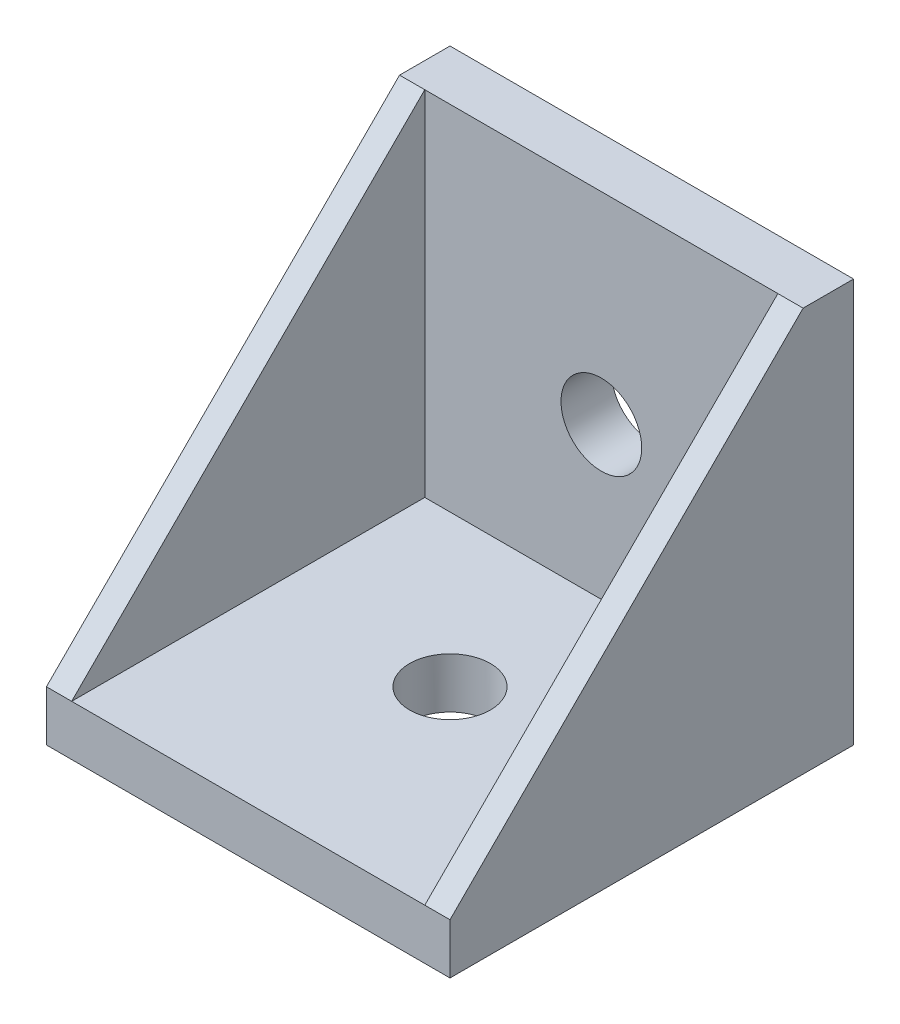
ISO-10303-21;
HEADER;
FILE_DESCRIPTION(('STEP AP214'),'2;1');
FILE_NAME('part.step','',(''),(''),'','','');
FILE_SCHEMA(('AUTOMOTIVE_DESIGN { 1 0 10303 214 1 1 1 1 }'));
ENDSEC;
DATA;
#1=APPLICATION_CONTEXT('core data for automotive mechanical design processes');
#2=APPLICATION_PROTOCOL_DEFINITION('international standard','automotive_design',2000,#1);
#3=PRODUCT_CONTEXT('',#1,'mechanical');
#4=PRODUCT('Part','Part','',(#3));
#5=PRODUCT_RELATED_PRODUCT_CATEGORY('part','',(#4));
#6=PRODUCT_DEFINITION_FORMATION('','',#4);
#7=PRODUCT_DEFINITION_CONTEXT('part definition',#1,'design');
#8=PRODUCT_DEFINITION('design','',#6,#7);
#9=PRODUCT_DEFINITION_SHAPE('','',#8);
#10=(LENGTH_UNIT() NAMED_UNIT(*) SI_UNIT(.MILLI.,.METRE.));
#11=(NAMED_UNIT(*) PLANE_ANGLE_UNIT() SI_UNIT($,.RADIAN.));
#12=(NAMED_UNIT(*) SI_UNIT($,.STERADIAN.) SOLID_ANGLE_UNIT());
#13=UNCERTAINTY_MEASURE_WITH_UNIT(LENGTH_MEASURE(1.E-05),#10,'distance_accuracy_value','');
#14=(GEOMETRIC_REPRESENTATION_CONTEXT(3) GLOBAL_UNCERTAINTY_ASSIGNED_CONTEXT((#13)) GLOBAL_UNIT_ASSIGNED_CONTEXT((#10,
#11,#12)) REPRESENTATION_CONTEXT('',''));
#15=CARTESIAN_POINT('',(0.,0.,0.));
#16=DIRECTION('',(0.,0.,1.));
#17=DIRECTION('',(1.,0.,0.));
#18=AXIS2_PLACEMENT_3D('',#15,#16,#17);
#19=CARTESIAN_POINT('',(-20.,40.,-15.));
#20=DIRECTION('',(0.,-0.707106781186548,-0.707106781186548));
#21=DIRECTION('',(0.,0.707106781186548,-0.707106781186548));
#22=AXIS2_PLACEMENT_3D('',#19,#20,#21);
#23=PLANE('',#22);
#24=DIRECTION('',(1.,0.,0.));
#25=VECTOR('',#24,1.);
#26=CARTESIAN_POINT('',(-20.,5.,20.));
#27=LINE('',#26,#25);
#28=CARTESIAN_POINT('',(-20.,5.,20.));
#29=VERTEX_POINT('',#28);
#30=CARTESIAN_POINT('',(-17.5,5.,20.));
#31=VERTEX_POINT('',#30);
#32=EDGE_CURVE('E152',#29,#31,#27,.T.);
#33=ORIENTED_EDGE('',*,*,#32,.T.);
#34=DIRECTION('',(0.,0.707106781186548,-0.707106781186548));
#35=VECTOR('',#34,1.);
#36=CARTESIAN_POINT('',(-17.5,40.,-15.));
#37=LINE('',#36,#35);
#38=CARTESIAN_POINT('',(-17.5,40.,-15.));
#39=VERTEX_POINT('',#38);
#40=EDGE_CURVE('E12',#31,#39,#37,.T.);
#41=ORIENTED_EDGE('',*,*,#40,.T.);
#42=DIRECTION('',(1.,0.,0.));
#43=VECTOR('',#42,1.);
#44=CARTESIAN_POINT('',(-20.,40.,-15.));
#45=LINE('',#44,#43);
#46=CARTESIAN_POINT('',(-20.,40.,-15.));
#47=VERTEX_POINT('',#46);
#48=EDGE_CURVE('E147',#47,#39,#45,.T.);
#49=ORIENTED_EDGE('',*,*,#48,.F.);
#50=DIRECTION('',(0.,0.707106781186548,-0.707106781186548));
#51=VECTOR('',#50,1.);
#52=CARTESIAN_POINT('',(-20.,40.,-15.));
#53=LINE('',#52,#51);
#54=EDGE_CURVE('E137',#29,#47,#53,.T.);
#55=ORIENTED_EDGE('',*,*,#54,.F.);
#56=EDGE_LOOP('',(#33,#41,#49,#55));
#57=FACE_BOUND('',#56,.T.);
#58=ADVANCED_FACE('F47',(#57),#23,.F.);
#59=CARTESIAN_POINT('',(20.,40.,-20.));
#60=DIRECTION('',(-1.,0.,0.));
#61=DIRECTION('',(0.,0.,1.));
#62=AXIS2_PLACEMENT_3D('',#59,#60,#61);
#63=PLANE('',#62);
#64=DIRECTION('',(0.,0.,-1.));
#65=VECTOR('',#64,1.);
#66=CARTESIAN_POINT('',(20.,40.,-20.));
#67=LINE('',#66,#65);
#68=CARTESIAN_POINT('',(20.,40.,-15.));
#69=VERTEX_POINT('',#68);
#70=CARTESIAN_POINT('',(20.,40.,-20.));
#71=VERTEX_POINT('',#70);
#72=EDGE_CURVE('E160',#69,#71,#67,.T.);
#73=ORIENTED_EDGE('',*,*,#72,.F.);
#74=DIRECTION('',(0.,-0.707106781186548,0.707106781186548));
#75=VECTOR('',#74,1.);
#76=CARTESIAN_POINT('',(20.,42.5,-17.5));
#77=LINE('',#76,#75);
#78=CARTESIAN_POINT('',(20.,5.,20.));
#79=VERTEX_POINT('',#78);
#80=EDGE_CURVE('E151',#69,#79,#77,.T.);
#81=ORIENTED_EDGE('',*,*,#80,.T.);
#82=DIRECTION('',(0.,-1.,0.));
#83=VECTOR('',#82,1.);
#84=CARTESIAN_POINT('',(20.,40.,20.));
#85=LINE('',#84,#83);
#86=CARTESIAN_POINT('',(20.,0.,20.));
#87=VERTEX_POINT('',#86);
#88=EDGE_CURVE('E171',#79,#87,#85,.T.);
#89=ORIENTED_EDGE('',*,*,#88,.T.);
#90=DIRECTION('',(0.,0.,-1.));
#91=VECTOR('',#90,1.);
#92=CARTESIAN_POINT('',(20.,0.,-20.));
#93=LINE('',#92,#91);
#94=CARTESIAN_POINT('',(20.,0.,-20.));
#95=VERTEX_POINT('',#94);
#96=EDGE_CURVE('E159',#87,#95,#93,.T.);
#97=ORIENTED_EDGE('',*,*,#96,.T.);
#98=DIRECTION('',(0.,-1.,0.));
#99=VECTOR('',#98,1.);
#100=CARTESIAN_POINT('',(20.,40.,-20.));
#101=LINE('',#100,#99);
#102=EDGE_CURVE('E194',#71,#95,#101,.T.);
#103=ORIENTED_EDGE('',*,*,#102,.F.);
#104=EDGE_LOOP('',(#73,#81,#89,#97,#103));
#105=FACE_BOUND('',#104,.T.);
#106=ADVANCED_FACE('F49',(#105),#63,.F.);
#107=CARTESIAN_POINT('',(-20.,40.,-20.));
#108=DIRECTION('',(0.,0.,1.));
#109=DIRECTION('',(1.,0.,0.));
#110=AXIS2_PLACEMENT_3D('',#107,#108,#109);
#111=PLANE('',#110);
#112=CARTESIAN_POINT('',(0.,20.,-20.));
#113=DIRECTION('',(0.,0.,1.));
#114=DIRECTION('',(1.,0.,0.));
#115=AXIS2_PLACEMENT_3D('',#112,#113,#114);
#116=CIRCLE('',#115,4.);
#117=CARTESIAN_POINT('',(4.,20.,-20.));
#118=VERTEX_POINT('',#117);
#119=EDGE_CURVE('E202',#118,#118,#116,.T.);
#120=ORIENTED_EDGE('',*,*,#119,.T.);
#121=EDGE_LOOP('',(#120));
#122=FACE_BOUND('',#121,.T.);
#123=DIRECTION('',(-1.,0.,0.));
#124=VECTOR('',#123,1.);
#125=CARTESIAN_POINT('',(-20.,0.,-20.));
#126=LINE('',#125,#124);
#127=CARTESIAN_POINT('',(-20.,0.,-20.));
#128=VERTEX_POINT('',#127);
#129=EDGE_CURVE('E175',#95,#128,#126,.T.);
#130=ORIENTED_EDGE('',*,*,#129,.T.);
#131=DIRECTION('',(0.,-1.,0.));
#132=VECTOR('',#131,1.);
#133=CARTESIAN_POINT('',(-20.,40.,-20.));
#134=LINE('',#133,#132);
#135=CARTESIAN_POINT('',(-20.,40.,-20.));
#136=VERTEX_POINT('',#135);
#137=EDGE_CURVE('E190',#136,#128,#134,.T.);
#138=ORIENTED_EDGE('',*,*,#137,.F.);
#139=DIRECTION('',(-1.,0.,0.));
#140=VECTOR('',#139,1.);
#141=CARTESIAN_POINT('',(-20.,40.,-20.));
#142=LINE('',#141,#140);
#143=EDGE_CURVE('E163',#71,#136,#142,.T.);
#144=ORIENTED_EDGE('',*,*,#143,.F.);
#145=ORIENTED_EDGE('',*,*,#102,.T.);
#146=EDGE_LOOP('',(#130,#138,#144,#145));
#147=FACE_BOUND('',#146,.T.);
#148=ADVANCED_FACE('F241',(#122,#147),#111,.F.);
#149=CARTESIAN_POINT('',(-20.,40.,-20.));
#150=DIRECTION('',(1.,0.,0.));
#151=DIRECTION('',(0.,0.,-1.));
#152=AXIS2_PLACEMENT_3D('',#149,#150,#151);
#153=PLANE('',#152);
#154=DIRECTION('',(0.,-1.,0.));
#155=VECTOR('',#154,1.);
#156=CARTESIAN_POINT('',(-20.,40.,20.));
#157=LINE('',#156,#155);
#158=CARTESIAN_POINT('',(-20.,0.,20.));
#159=VERTEX_POINT('',#158);
#160=EDGE_CURVE('E187',#29,#159,#157,.T.);
#161=ORIENTED_EDGE('',*,*,#160,.F.);
#162=ORIENTED_EDGE('',*,*,#54,.T.);
#163=DIRECTION('',(0.,0.,1.));
#164=VECTOR('',#163,1.);
#165=CARTESIAN_POINT('',(-20.,40.,-20.));
#166=LINE('',#165,#164);
#167=EDGE_CURVE('E167',#136,#47,#166,.T.);
#168=ORIENTED_EDGE('',*,*,#167,.F.);
#169=ORIENTED_EDGE('',*,*,#137,.T.);
#170=DIRECTION('',(0.,0.,1.));
#171=VECTOR('',#170,1.);
#172=CARTESIAN_POINT('',(-20.,0.,-20.));
#173=LINE('',#172,#171);
#174=EDGE_CURVE('E178',#128,#159,#173,.T.);
#175=ORIENTED_EDGE('',*,*,#174,.T.);
#176=EDGE_LOOP('',(#161,#162,#168,#169,#175));
#177=FACE_BOUND('',#176,.T.);
#178=ADVANCED_FACE('F245',(#177),#153,.F.);
#179=CARTESIAN_POINT('',(-20.,40.,20.));
#180=DIRECTION('',(0.,0.,-1.));
#181=DIRECTION('',(-1.,0.,0.));
#182=AXIS2_PLACEMENT_3D('',#179,#180,#181);
#183=PLANE('',#182);
#184=ORIENTED_EDGE('',*,*,#88,.F.);
#185=CARTESIAN_POINT('',(17.5,5.,20.));
#186=VERTEX_POINT('',#185);
#187=EDGE_CURVE('E142',#186,#79,#27,.T.);
#188=ORIENTED_EDGE('',*,*,#187,.F.);
#189=EDGE_CURVE('E129',#31,#186,#27,.T.);
#190=ORIENTED_EDGE('',*,*,#189,.F.);
#191=ORIENTED_EDGE('',*,*,#32,.F.);
#192=ORIENTED_EDGE('',*,*,#160,.T.);
#193=DIRECTION('',(1.,0.,0.));
#194=VECTOR('',#193,1.);
#195=CARTESIAN_POINT('',(-20.,0.,20.));
#196=LINE('',#195,#194);
#197=EDGE_CURVE('E164',#159,#87,#196,.T.);
#198=ORIENTED_EDGE('',*,*,#197,.T.);
#199=EDGE_LOOP('',(#184,#188,#190,#191,#192,#198));
#200=FACE_BOUND('',#199,.T.);
#201=ADVANCED_FACE('F225',(#200),#183,.F.);
#202=CARTESIAN_POINT('',(0.,40.,0.));
#203=DIRECTION('',(0.,1.,0.));
#204=DIRECTION('',(0.,0.,1.));
#205=AXIS2_PLACEMENT_3D('',#202,#203,#204);
#206=PLANE('',#205);
#207=ORIENTED_EDGE('',*,*,#48,.T.);
#208=DIRECTION('',(1.,0.,0.));
#209=VECTOR('',#208,1.);
#210=CARTESIAN_POINT('',(-17.5,40.,-15.));
#211=LINE('',#210,#209);
#212=CARTESIAN_POINT('',(17.5,40.,-15.));
#213=VERTEX_POINT('',#212);
#214=EDGE_CURVE('E121',#39,#213,#211,.T.);
#215=ORIENTED_EDGE('',*,*,#214,.T.);
#216=EDGE_CURVE('E73',#213,#69,#45,.T.);
#217=ORIENTED_EDGE('',*,*,#216,.T.);
#218=ORIENTED_EDGE('',*,*,#72,.T.);
#219=ORIENTED_EDGE('',*,*,#143,.T.);
#220=ORIENTED_EDGE('',*,*,#167,.T.);
#221=EDGE_LOOP('',(#207,#215,#217,#218,#219,#220));
#222=FACE_BOUND('',#221,.T.);
#223=ADVANCED_FACE('F217',(#222),#206,.T.);
#224=CARTESIAN_POINT('',(0.,0.,0.));
#225=DIRECTION('',(0.,1.,0.));
#226=DIRECTION('',(0.,0.,1.));
#227=AXIS2_PLACEMENT_3D('',#224,#225,#226);
#228=PLANE('',#227);
#229=CARTESIAN_POINT('',(0.,0.,0.));
#230=DIRECTION('',(0.,1.,0.));
#231=DIRECTION('',(0.,0.,1.));
#232=AXIS2_PLACEMENT_3D('',#229,#230,#231);
#233=CIRCLE('',#232,4.);
#234=CARTESIAN_POINT('',(0.,0.,4.));
#235=VERTEX_POINT('',#234);
#236=EDGE_CURVE('E213',#235,#235,#233,.T.);
#237=ORIENTED_EDGE('',*,*,#236,.T.);
#238=EDGE_LOOP('',(#237));
#239=FACE_BOUND('',#238,.T.);
#240=ORIENTED_EDGE('',*,*,#96,.F.);
#241=ORIENTED_EDGE('',*,*,#197,.F.);
#242=ORIENTED_EDGE('',*,*,#174,.F.);
#243=ORIENTED_EDGE('',*,*,#129,.F.);
#244=EDGE_LOOP('',(#240,#241,#242,#243));
#245=FACE_BOUND('',#244,.T.);
#246=ADVANCED_FACE('F238',(#239,#245),#228,.F.);
#247=ORIENTED_EDGE('',*,*,#216,.F.);
#248=DIRECTION('',(0.,-0.707106781186548,0.707106781186548));
#249=VECTOR('',#248,1.);
#250=CARTESIAN_POINT('',(17.5,40.,-15.));
#251=LINE('',#250,#249);
#252=EDGE_CURVE('E57',#213,#186,#251,.T.);
#253=ORIENTED_EDGE('',*,*,#252,.T.);
#254=ORIENTED_EDGE('',*,*,#187,.T.);
#255=ORIENTED_EDGE('',*,*,#80,.F.);
#256=EDGE_LOOP('',(#247,#253,#254,#255));
#257=FACE_BOUND('',#256,.T.);
#258=ADVANCED_FACE('F230',(#257),#23,.F.);
#259=CARTESIAN_POINT('',(-17.5,5.,-69.4974746830583));
#260=DIRECTION('',(-1.,0.,0.));
#261=DIRECTION('',(0.,0.,1.));
#262=AXIS2_PLACEMENT_3D('',#259,#260,#261);
#263=PLANE('',#262);
#264=DIRECTION('',(0.,0.,1.));
#265=VECTOR('',#264,1.);
#266=CARTESIAN_POINT('',(-17.5,5.,-69.4974746830583));
#267=LINE('',#266,#265);
#268=CARTESIAN_POINT('',(-17.5,5.,-15.));
#269=VERTEX_POINT('',#268);
#270=EDGE_CURVE('E131',#269,#31,#267,.T.);
#271=ORIENTED_EDGE('',*,*,#270,.F.);
#272=DIRECTION('',(0.,1.,0.));
#273=VECTOR('',#272,1.);
#274=CARTESIAN_POINT('',(-17.5,5.,-15.));
#275=LINE('',#274,#273);
#276=EDGE_CURVE('E134',#269,#39,#275,.T.);
#277=ORIENTED_EDGE('',*,*,#276,.T.);
#278=ORIENTED_EDGE('',*,*,#40,.F.);
#279=EDGE_LOOP('',(#271,#277,#278));
#280=FACE_BOUND('',#279,.T.);
#281=ADVANCED_FACE('F221',(#280),#263,.F.);
#282=CARTESIAN_POINT('',(17.5,5.,-69.4974746830583));
#283=DIRECTION('',(1.,0.,0.));
#284=DIRECTION('',(0.,0.,-1.));
#285=AXIS2_PLACEMENT_3D('',#282,#283,#284);
#286=PLANE('',#285);
#287=DIRECTION('',(0.,-1.,0.));
#288=VECTOR('',#287,1.);
#289=CARTESIAN_POINT('',(17.5,5.,-15.));
#290=LINE('',#289,#288);
#291=CARTESIAN_POINT('',(17.5,5.,-15.));
#292=VERTEX_POINT('',#291);
#293=EDGE_CURVE('E65',#213,#292,#290,.T.);
#294=ORIENTED_EDGE('',*,*,#293,.T.);
#295=DIRECTION('',(0.,0.,1.));
#296=VECTOR('',#295,1.);
#297=CARTESIAN_POINT('',(17.5,5.,-69.4974746830583));
#298=LINE('',#297,#296);
#299=EDGE_CURVE('E118',#292,#186,#298,.T.);
#300=ORIENTED_EDGE('',*,*,#299,.T.);
#301=ORIENTED_EDGE('',*,*,#252,.F.);
#302=EDGE_LOOP('',(#294,#300,#301));
#303=FACE_BOUND('',#302,.T.);
#304=ADVANCED_FACE('F117',(#303),#286,.F.);
#305=CARTESIAN_POINT('',(-17.5,5.,-69.4974746830583));
#306=DIRECTION('',(0.,-1.,0.));
#307=DIRECTION('',(0.,0.,-1.));
#308=AXIS2_PLACEMENT_3D('',#305,#306,#307);
#309=PLANE('',#308);
#310=CARTESIAN_POINT('',(0.,5.,0.));
#311=DIRECTION('',(0.,-1.,0.));
#312=DIRECTION('',(0.,0.,-1.));
#313=AXIS2_PLACEMENT_3D('',#310,#311,#312);
#314=CIRCLE('',#313,4.);
#315=CARTESIAN_POINT('',(0.,5.,-4.));
#316=VERTEX_POINT('',#315);
#317=EDGE_CURVE('E51',#316,#316,#314,.T.);
#318=ORIENTED_EDGE('',*,*,#317,.T.);
#319=EDGE_LOOP('',(#318));
#320=FACE_BOUND('',#319,.T.);
#321=ORIENTED_EDGE('',*,*,#299,.F.);
#322=DIRECTION('',(-1.,0.,0.));
#323=VECTOR('',#322,1.);
#324=CARTESIAN_POINT('',(-17.5,5.,-15.));
#325=LINE('',#324,#323);
#326=EDGE_CURVE('E126',#292,#269,#325,.T.);
#327=ORIENTED_EDGE('',*,*,#326,.T.);
#328=ORIENTED_EDGE('',*,*,#270,.T.);
#329=ORIENTED_EDGE('',*,*,#189,.T.);
#330=EDGE_LOOP('',(#321,#327,#328,#329));
#331=FACE_BOUND('',#330,.T.);
#332=ADVANCED_FACE('F124',(#320,#331),#309,.F.);
#333=CARTESIAN_POINT('',(-20.,40.,-15.));
#334=DIRECTION('',(0.,0.,1.));
#335=DIRECTION('',(1.,0.,0.));
#336=AXIS2_PLACEMENT_3D('',#333,#334,#335);
#337=PLANE('',#336);
#338=CARTESIAN_POINT('',(0.,20.,-15.));
#339=DIRECTION('',(0.,0.,1.));
#340=DIRECTION('',(1.,0.,0.));
#341=AXIS2_PLACEMENT_3D('',#338,#339,#340);
#342=CIRCLE('',#341,4.);
#343=CARTESIAN_POINT('',(4.,20.,-15.));
#344=VERTEX_POINT('',#343);
#345=EDGE_CURVE('E199',#344,#344,#342,.T.);
#346=ORIENTED_EDGE('',*,*,#345,.F.);
#347=EDGE_LOOP('',(#346));
#348=FACE_BOUND('',#347,.T.);
#349=ORIENTED_EDGE('',*,*,#276,.F.);
#350=ORIENTED_EDGE('',*,*,#326,.F.);
#351=ORIENTED_EDGE('',*,*,#293,.F.);
#352=ORIENTED_EDGE('',*,*,#214,.F.);
#353=EDGE_LOOP('',(#349,#350,#351,#352));
#354=FACE_BOUND('',#353,.T.);
#355=ADVANCED_FACE('F133',(#348,#354),#337,.T.);
#356=CARTESIAN_POINT('',(0.,20.,-20.));
#357=DIRECTION('',(0.,0.,1.));
#358=DIRECTION('',(1.,0.,0.));
#359=AXIS2_PLACEMENT_3D('',#356,#357,#358);
#360=CYLINDRICAL_SURFACE('',#359,4.);
#361=ORIENTED_EDGE('',*,*,#345,.T.);
#362=EDGE_LOOP('',(#361));
#363=FACE_BOUND('',#362,.T.);
#364=ORIENTED_EDGE('',*,*,#119,.F.);
#365=EDGE_LOOP('',(#364));
#366=FACE_BOUND('',#365,.T.);
#367=ADVANCED_FACE('F279',(#363,#366),#360,.F.);
#368=CARTESIAN_POINT('',(0.,0.,0.));
#369=DIRECTION('',(0.,1.,0.));
#370=DIRECTION('',(0.,0.,1.));
#371=AXIS2_PLACEMENT_3D('',#368,#369,#370);
#372=CYLINDRICAL_SURFACE('',#371,4.);
#373=ORIENTED_EDGE('',*,*,#236,.F.);
#374=EDGE_LOOP('',(#373));
#375=FACE_BOUND('',#374,.T.);
#376=ORIENTED_EDGE('',*,*,#317,.F.);
#377=EDGE_LOOP('',(#376));
#378=FACE_BOUND('',#377,.T.);
#379=ADVANCED_FACE('F276',(#375,#378),#372,.F.);
#380=CLOSED_SHELL('',(#58,#106,#148,#178,#201,#223,#246,#258,#281,#304,#332,#355,#367,#379));
#381=MANIFOLD_SOLID_BREP('B2',#380);
#382=ADVANCED_BREP_SHAPE_REPRESENTATION('',(#18,#381),#14);
#383=SHAPE_DEFINITION_REPRESENTATION(#9,#382);
ENDSEC;
END-ISO-10303-21;
